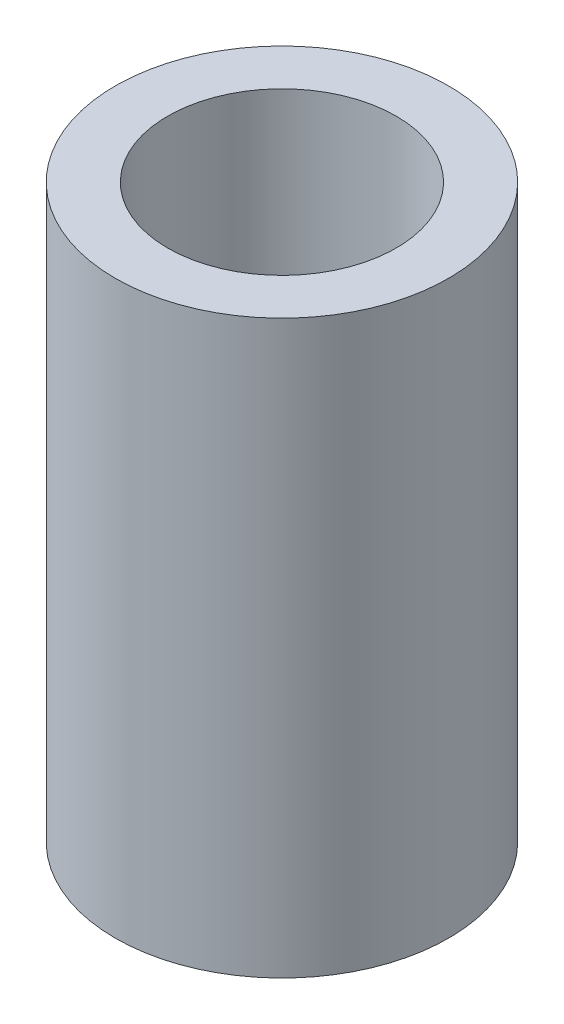
ISO-10303-21;
HEADER;
FILE_DESCRIPTION(('STEP AP214'),'2;1');
FILE_NAME('part.step','',(''),(''),'','','');
FILE_SCHEMA(('AUTOMOTIVE_DESIGN { 1 0 10303 214 1 1 1 1 }'));
ENDSEC;
DATA;
#1=APPLICATION_CONTEXT('core data for automotive mechanical design processes');
#2=APPLICATION_PROTOCOL_DEFINITION('international standard','automotive_design',2000,#1);
#3=PRODUCT_CONTEXT('',#1,'mechanical');
#4=PRODUCT('Part','Part','',(#3));
#5=PRODUCT_RELATED_PRODUCT_CATEGORY('part','',(#4));
#6=PRODUCT_DEFINITION_FORMATION('','',#4);
#7=PRODUCT_DEFINITION_CONTEXT('part definition',#1,'design');
#8=PRODUCT_DEFINITION('design','',#6,#7);
#9=PRODUCT_DEFINITION_SHAPE('','',#8);
#10=(LENGTH_UNIT() NAMED_UNIT(*) SI_UNIT(.MILLI.,.METRE.));
#11=(NAMED_UNIT(*) PLANE_ANGLE_UNIT() SI_UNIT($,.RADIAN.));
#12=(NAMED_UNIT(*) SI_UNIT($,.STERADIAN.) SOLID_ANGLE_UNIT());
#13=UNCERTAINTY_MEASURE_WITH_UNIT(LENGTH_MEASURE(1.E-05),#10,'distance_accuracy_value','');
#14=(GEOMETRIC_REPRESENTATION_CONTEXT(3) GLOBAL_UNCERTAINTY_ASSIGNED_CONTEXT((#13)) GLOBAL_UNIT_ASSIGNED_CONTEXT((#10,
#11,#12)) REPRESENTATION_CONTEXT('',''));
#15=CARTESIAN_POINT('',(0.,0.,0.));
#16=DIRECTION('',(0.,0.,1.));
#17=DIRECTION('',(1.,0.,0.));
#18=AXIS2_PLACEMENT_3D('',#15,#16,#17);
#19=CARTESIAN_POINT('',(0.,6.,0.));
#20=DIRECTION('',(0.,1.,0.));
#21=DIRECTION('',(0.,0.,1.));
#22=AXIS2_PLACEMENT_3D('',#19,#20,#21);
#23=PLANE('',#22);
#24=CARTESIAN_POINT('',(0.,6.,0.));
#25=DIRECTION('',(0.,1.,0.));
#26=DIRECTION('',(0.,0.,1.));
#27=AXIS2_PLACEMENT_3D('',#24,#25,#26);
#28=CIRCLE('',#27,1.75);
#29=CARTESIAN_POINT('',(0.,6.,1.75));
#30=VERTEX_POINT('',#29);
#31=EDGE_CURVE('E10',#30,#30,#28,.T.);
#32=ORIENTED_EDGE('',*,*,#31,.T.);
#33=EDGE_LOOP('',(#32));
#34=FACE_BOUND('',#33,.T.);
#35=CARTESIAN_POINT('',(0.,6.,0.));
#36=DIRECTION('',(0.,1.,0.));
#37=DIRECTION('',(0.,0.,1.));
#38=AXIS2_PLACEMENT_3D('',#35,#36,#37);
#39=CIRCLE('',#38,1.2);
#40=CARTESIAN_POINT('',(0.,6.,1.2));
#41=VERTEX_POINT('',#40);
#42=EDGE_CURVE('E50',#41,#41,#39,.T.);
#43=ORIENTED_EDGE('',*,*,#42,.F.);
#44=EDGE_LOOP('',(#43));
#45=FACE_BOUND('',#44,.T.);
#46=ADVANCED_FACE('F35',(#34,#45),#23,.T.);
#47=CARTESIAN_POINT('',(0.,0.,0.));
#48=DIRECTION('',(0.,1.,0.));
#49=DIRECTION('',(0.,0.,1.));
#50=AXIS2_PLACEMENT_3D('',#47,#48,#49);
#51=PLANE('',#50);
#52=CARTESIAN_POINT('',(0.,0.,0.));
#53=DIRECTION('',(0.,1.,0.));
#54=DIRECTION('',(0.,0.,1.));
#55=AXIS2_PLACEMENT_3D('',#52,#53,#54);
#56=CIRCLE('',#55,1.75);
#57=CARTESIAN_POINT('',(0.,0.,1.75));
#58=VERTEX_POINT('',#57);
#59=EDGE_CURVE('E39',#58,#58,#56,.T.);
#60=ORIENTED_EDGE('',*,*,#59,.F.);
#61=EDGE_LOOP('',(#60));
#62=FACE_BOUND('',#61,.T.);
#63=CARTESIAN_POINT('',(0.,0.,0.));
#64=DIRECTION('',(0.,1.,0.));
#65=DIRECTION('',(0.,0.,1.));
#66=AXIS2_PLACEMENT_3D('',#63,#64,#65);
#67=CIRCLE('',#66,1.2);
#68=CARTESIAN_POINT('',(0.,0.,1.2));
#69=VERTEX_POINT('',#68);
#70=EDGE_CURVE('E52',#69,#69,#67,.T.);
#71=ORIENTED_EDGE('',*,*,#70,.T.);
#72=EDGE_LOOP('',(#71));
#73=FACE_BOUND('',#72,.T.);
#74=ADVANCED_FACE('F62',(#62,#73),#51,.F.);
#75=CARTESIAN_POINT('',(0.,6.,0.));
#76=DIRECTION('',(0.,-1.,0.));
#77=DIRECTION('',(0.,0.,-1.));
#78=AXIS2_PLACEMENT_3D('',#75,#76,#77);
#79=CYLINDRICAL_SURFACE('',#78,1.75);
#80=ORIENTED_EDGE('',*,*,#31,.F.);
#81=EDGE_LOOP('',(#80));
#82=FACE_BOUND('',#81,.T.);
#83=ORIENTED_EDGE('',*,*,#59,.T.);
#84=EDGE_LOOP('',(#83));
#85=FACE_BOUND('',#84,.T.);
#86=ADVANCED_FACE('F37',(#82,#85),#79,.T.);
#87=CARTESIAN_POINT('',(0.,6.,0.));
#88=DIRECTION('',(0.,-1.,0.));
#89=DIRECTION('',(0.,0.,-1.));
#90=AXIS2_PLACEMENT_3D('',#87,#88,#89);
#91=CYLINDRICAL_SURFACE('',#90,1.2);
#92=ORIENTED_EDGE('',*,*,#42,.T.);
#93=EDGE_LOOP('',(#92));
#94=FACE_BOUND('',#93,.T.);
#95=ORIENTED_EDGE('',*,*,#70,.F.);
#96=EDGE_LOOP('',(#95));
#97=FACE_BOUND('',#96,.T.);
#98=ADVANCED_FACE('F58',(#94,#97),#91,.F.);
#99=CLOSED_SHELL('',(#46,#74,#86,#98));
#100=MANIFOLD_SOLID_BREP('B2',#99);
#101=ADVANCED_BREP_SHAPE_REPRESENTATION('',(#18,#100),#14);
#102=SHAPE_DEFINITION_REPRESENTATION(#9,#101);
ENDSEC;
END-ISO-10303-21;
